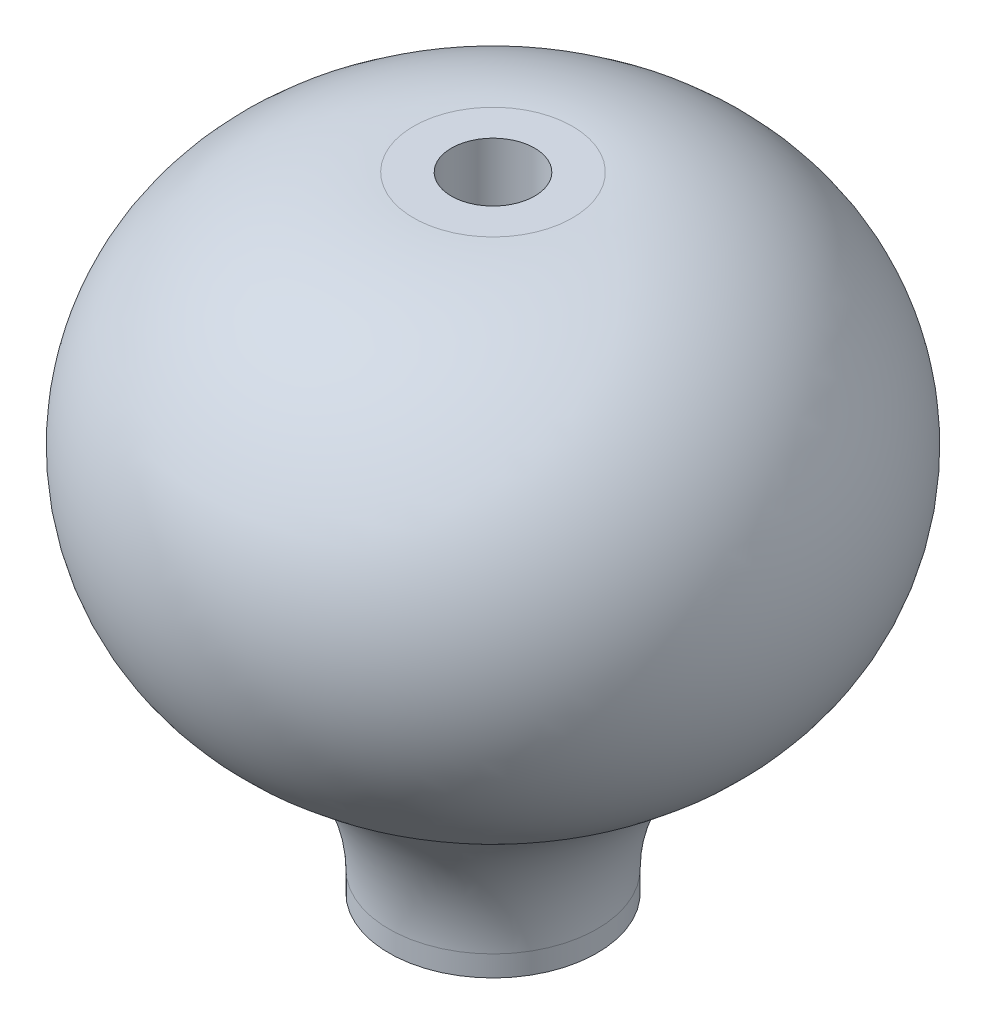
ISO-10303-21;
HEADER;
FILE_DESCRIPTION(('STEP AP214'),'2;1');
FILE_NAME('part.step','',(''),(''),'','','');
FILE_SCHEMA(('AUTOMOTIVE_DESIGN { 1 0 10303 214 1 1 1 1 }'));
ENDSEC;
DATA;
#1=APPLICATION_CONTEXT('core data for automotive mechanical design processes');
#2=APPLICATION_PROTOCOL_DEFINITION('international standard','automotive_design',2000,#1);
#3=PRODUCT_CONTEXT('',#1,'mechanical');
#4=PRODUCT('Part','Part','',(#3));
#5=PRODUCT_RELATED_PRODUCT_CATEGORY('part','',(#4));
#6=PRODUCT_DEFINITION_FORMATION('','',#4);
#7=PRODUCT_DEFINITION_CONTEXT('part definition',#1,'design');
#8=PRODUCT_DEFINITION('design','',#6,#7);
#9=PRODUCT_DEFINITION_SHAPE('','',#8);
#10=(LENGTH_UNIT() NAMED_UNIT(*) SI_UNIT(.MILLI.,.METRE.));
#11=(NAMED_UNIT(*) PLANE_ANGLE_UNIT() SI_UNIT($,.RADIAN.));
#12=(NAMED_UNIT(*) SI_UNIT($,.STERADIAN.) SOLID_ANGLE_UNIT());
#13=UNCERTAINTY_MEASURE_WITH_UNIT(LENGTH_MEASURE(1.E-05),#10,'distance_accuracy_value','');
#14=(GEOMETRIC_REPRESENTATION_CONTEXT(3) GLOBAL_UNCERTAINTY_ASSIGNED_CONTEXT((#13)) GLOBAL_UNIT_ASSIGNED_CONTEXT((#10,
#11,#12)) REPRESENTATION_CONTEXT('',''));
#15=CARTESIAN_POINT('',(0.,0.,0.));
#16=DIRECTION('',(0.,0.,1.));
#17=DIRECTION('',(1.,0.,0.));
#18=AXIS2_PLACEMENT_3D('',#15,#16,#17);
#19=CARTESIAN_POINT('',(0.,38.1,0.));
#20=DIRECTION('',(0.,1.,0.));
#21=DIRECTION('',(0.,0.,1.));
#22=AXIS2_PLACEMENT_3D('',#19,#20,#21);
#23=PLANE('',#22);
#24=CARTESIAN_POINT('',(0.,38.1,0.));
#25=DIRECTION('',(0.,1.,0.));
#26=DIRECTION('',(0.,0.,1.));
#27=AXIS2_PLACEMENT_3D('',#24,#25,#26);
#28=CIRCLE('',#27,2.54);
#29=CARTESIAN_POINT('',(0.,38.1,2.54));
#30=VERTEX_POINT('',#29);
#31=EDGE_CURVE('E68',#30,#30,#28,.T.);
#32=ORIENTED_EDGE('',*,*,#31,.F.);
#33=EDGE_LOOP('',(#32));
#34=FACE_BOUND('',#33,.T.);
#35=CARTESIAN_POINT('',(0.,38.1,0.));
#36=DIRECTION('',(0.,-1.,0.));
#37=DIRECTION('',(0.,0.,-1.));
#38=AXIS2_PLACEMENT_3D('',#35,#36,#37);
#39=CIRCLE('',#38,4.84877197327399);
#40=CARTESIAN_POINT('',(0.,38.1,-4.84877197327399));
#41=VERTEX_POINT('',#40);
#42=EDGE_CURVE('E12',#41,#41,#39,.T.);
#43=ORIENTED_EDGE('',*,*,#42,.F.);
#44=EDGE_LOOP('',(#43));
#45=FACE_BOUND('',#44,.T.);
#46=ADVANCED_FACE('F48',(#34,#45),#23,.T.);
#47=CARTESIAN_POINT('',(0.,23.667543946548,0.));
#48=DIRECTION('',(0.,-1.,0.));
#49=DIRECTION('',(0.,0.,-1.));
#50=AXIS2_PLACEMENT_3D('',#47,#48,#49);
#51=DEGENERATE_TOROIDAL_SURFACE('',#50,4.84877197327399,14.432456053452,.T.);
#52=ORIENTED_EDGE('',*,*,#42,.T.);
#53=EDGE_LOOP('',(#52));
#54=FACE_BOUND('',#53,.T.);
#55=CARTESIAN_POINT('',(0.,11.1686703652562,0.));
#56=DIRECTION('',(0.,-1.,0.));
#57=DIRECTION('',(0.,0.,-1.));
#58=AXIS2_PLACEMENT_3D('',#55,#56,#57);
#59=CIRCLE('',#58,12.065);
#60=CARTESIAN_POINT('',(0.,11.1686703652562,-12.065));
#61=VERTEX_POINT('',#60);
#62=EDGE_CURVE('E54',#61,#61,#59,.T.);
#63=ORIENTED_EDGE('',*,*,#62,.F.);
#64=EDGE_LOOP('',(#63));
#65=FACE_BOUND('',#64,.T.);
#66=ADVANCED_FACE('F85',(#54,#65),#51,.T.);
#67=CARTESIAN_POINT('',(0.,1.26999999999999,0.));
#68=DIRECTION('',(0.,-1.,0.));
#69=DIRECTION('',(0.,0.,-1.));
#70=AXIS2_PLACEMENT_3D('',#67,#68,#69);
#71=TOROIDAL_SURFACE('',#70,17.78,11.43);
#72=ORIENTED_EDGE('',*,*,#62,.T.);
#73=EDGE_LOOP('',(#72));
#74=FACE_BOUND('',#73,.T.);
#75=CARTESIAN_POINT('',(0.,1.26999999999999,0.));
#76=DIRECTION('',(0.,-1.,0.));
#77=DIRECTION('',(0.,0.,-1.));
#78=AXIS2_PLACEMENT_3D('',#75,#76,#77);
#79=CIRCLE('',#78,6.35);
#80=CARTESIAN_POINT('',(0.,1.26999999999999,-6.35));
#81=VERTEX_POINT('',#80);
#82=EDGE_CURVE('E58',#81,#81,#79,.T.);
#83=ORIENTED_EDGE('',*,*,#82,.F.);
#84=EDGE_LOOP('',(#83));
#85=FACE_BOUND('',#84,.T.);
#86=ADVANCED_FACE('F89',(#74,#85),#71,.F.);
#87=CARTESIAN_POINT('',(0.,0.,0.));
#88=DIRECTION('',(0.,-1.,0.));
#89=DIRECTION('',(0.,0.,-1.));
#90=AXIS2_PLACEMENT_3D('',#87,#88,#89);
#91=CYLINDRICAL_SURFACE('',#90,6.35);
#92=ORIENTED_EDGE('',*,*,#82,.T.);
#93=EDGE_LOOP('',(#92));
#94=FACE_BOUND('',#93,.T.);
#95=CARTESIAN_POINT('',(0.,0.,0.));
#96=DIRECTION('',(0.,-1.,0.));
#97=DIRECTION('',(0.,0.,-1.));
#98=AXIS2_PLACEMENT_3D('',#95,#96,#97);
#99=CIRCLE('',#98,6.35);
#100=CARTESIAN_POINT('',(0.,0.,-6.35));
#101=VERTEX_POINT('',#100);
#102=EDGE_CURVE('E62',#101,#101,#99,.T.);
#103=ORIENTED_EDGE('',*,*,#102,.F.);
#104=EDGE_LOOP('',(#103));
#105=FACE_BOUND('',#104,.T.);
#106=ADVANCED_FACE('F93',(#94,#105),#91,.T.);
#107=CARTESIAN_POINT('',(0.,0.,0.));
#108=DIRECTION('',(0.,-1.,0.));
#109=DIRECTION('',(0.,0.,-1.));
#110=AXIS2_PLACEMENT_3D('',#107,#108,#109);
#111=PLANE('',#110);
#112=CARTESIAN_POINT('',(0.,0.,0.));
#113=DIRECTION('',(0.,1.,0.));
#114=DIRECTION('',(0.,0.,1.));
#115=AXIS2_PLACEMENT_3D('',#112,#113,#114);
#116=CIRCLE('',#115,2.54);
#117=CARTESIAN_POINT('',(0.,0.,2.54));
#118=VERTEX_POINT('',#117);
#119=EDGE_CURVE('E67',#118,#118,#116,.T.);
#120=ORIENTED_EDGE('',*,*,#119,.T.);
#121=EDGE_LOOP('',(#120));
#122=FACE_BOUND('',#121,.T.);
#123=ORIENTED_EDGE('',*,*,#102,.T.);
#124=EDGE_LOOP('',(#123));
#125=FACE_BOUND('',#124,.T.);
#126=ADVANCED_FACE('F74',(#122,#125),#111,.T.);
#127=CARTESIAN_POINT('',(0.,0.,0.));
#128=DIRECTION('',(0.,1.,0.));
#129=DIRECTION('',(0.,0.,1.));
#130=AXIS2_PLACEMENT_3D('',#127,#128,#129);
#131=CYLINDRICAL_SURFACE('',#130,2.54);
#132=CARTESIAN_POINT('',(0.,0.,2.54));
#133=CARTESIAN_POINT('',(0.,0.396875000000001,2.54));
#134=CARTESIAN_POINT('',(0.,0.793750000000001,2.54));
#135=CARTESIAN_POINT('',(0.,1.5875,2.54));
#136=CARTESIAN_POINT('',(0.,1.984375,2.54));
#137=CARTESIAN_POINT('',(0.,2.778125,2.54));
#138=CARTESIAN_POINT('',(0.,3.175,2.54));
#139=CARTESIAN_POINT('',(0.,3.96875,2.54));
#140=CARTESIAN_POINT('',(0.,4.365625,2.54));
#141=CARTESIAN_POINT('',(0.,5.159375,2.54));
#142=CARTESIAN_POINT('',(0.,5.55625,2.54));
#143=CARTESIAN_POINT('',(0.,6.35,2.54));
#144=CARTESIAN_POINT('',(0.,6.746875,2.54));
#145=CARTESIAN_POINT('',(0.,7.540625,2.54));
#146=CARTESIAN_POINT('',(0.,7.9375,2.54));
#147=CARTESIAN_POINT('',(0.,8.73125,2.54));
#148=CARTESIAN_POINT('',(0.,9.128125,2.54));
#149=CARTESIAN_POINT('',(0.,9.921875,2.54));
#150=CARTESIAN_POINT('',(0.,10.31875,2.54));
#151=CARTESIAN_POINT('',(0.,11.1125,2.54));
#152=CARTESIAN_POINT('',(0.,11.509375,2.54));
#153=CARTESIAN_POINT('',(0.,12.303125,2.54));
#154=CARTESIAN_POINT('',(0.,12.7,2.54));
#155=CARTESIAN_POINT('',(0.,13.49375,2.54));
#156=CARTESIAN_POINT('',(0.,13.890625,2.54));
#157=CARTESIAN_POINT('',(0.,14.684375,2.54));
#158=CARTESIAN_POINT('',(0.,15.08125,2.54));
#159=CARTESIAN_POINT('',(0.,15.875,2.54));
#160=CARTESIAN_POINT('',(0.,16.271875,2.54));
#161=CARTESIAN_POINT('',(0.,17.065625,2.54));
#162=CARTESIAN_POINT('',(0.,17.4625,2.54));
#163=CARTESIAN_POINT('',(0.,18.25625,2.54));
#164=CARTESIAN_POINT('',(0.,18.653125,2.54));
#165=CARTESIAN_POINT('',(0.,19.446875,2.54));
#166=CARTESIAN_POINT('',(0.,19.84375,2.54));
#167=CARTESIAN_POINT('',(0.,20.6375,2.54));
#168=CARTESIAN_POINT('',(0.,21.034375,2.54));
#169=CARTESIAN_POINT('',(0.,21.828125,2.54));
#170=CARTESIAN_POINT('',(0.,22.225,2.54));
#171=CARTESIAN_POINT('',(0.,23.01875,2.54));
#172=CARTESIAN_POINT('',(0.,23.415625,2.54));
#173=CARTESIAN_POINT('',(0.,24.209375,2.54));
#174=CARTESIAN_POINT('',(0.,24.60625,2.54));
#175=CARTESIAN_POINT('',(0.,25.4,2.54));
#176=CARTESIAN_POINT('',(0.,25.796875,2.54));
#177=CARTESIAN_POINT('',(0.,26.590625,2.54));
#178=CARTESIAN_POINT('',(0.,26.9875,2.54));
#179=CARTESIAN_POINT('',(0.,27.78125,2.54));
#180=CARTESIAN_POINT('',(0.,28.178125,2.54));
#181=CARTESIAN_POINT('',(0.,28.971875,2.54));
#182=CARTESIAN_POINT('',(0.,29.36875,2.54));
#183=CARTESIAN_POINT('',(0.,30.1625,2.54));
#184=CARTESIAN_POINT('',(0.,30.559375,2.54));
#185=CARTESIAN_POINT('',(0.,31.353125,2.54));
#186=CARTESIAN_POINT('',(0.,31.75,2.54));
#187=CARTESIAN_POINT('',(0.,32.54375,2.54));
#188=CARTESIAN_POINT('',(0.,32.940625,2.54));
#189=CARTESIAN_POINT('',(0.,33.734375,2.54));
#190=CARTESIAN_POINT('',(0.,34.13125,2.54));
#191=CARTESIAN_POINT('',(0.,34.925,2.54));
#192=CARTESIAN_POINT('',(0.,35.321875,2.54));
#193=CARTESIAN_POINT('',(0.,36.115625,2.54));
#194=CARTESIAN_POINT('',(0.,36.5125,2.54));
#195=CARTESIAN_POINT('',(0.,37.30625,2.54));
#196=CARTESIAN_POINT('',(0.,37.703125,2.54));
#197=CARTESIAN_POINT('',(0.,38.1,2.54));
#198=B_SPLINE_CURVE_WITH_KNOTS('',3,(#132,#133,#134,#135,#136,#137,#138,#139,#140,#141,#142,
#143,#144,#145,#146,#147,#148,#149,#150,#151,#152,#153,#154,#155,#156,#157,#158,#159,#160,#161,
#162,#163,#164,#165,#166,#167,#168,#169,#170,#171,#172,#173,#174,#175,#176,#177,#178,#179,#180,
#181,#182,#183,#184,#185,#186,#187,#188,#189,#190,#191,#192,#193,#194,#195,#196,#197),
.UNSPECIFIED.,.F.,.F.,(4,2,2,2,2,2,2,2,2,2,2,2,2,2,2,2,2,2,2,2,2,2,2,2,2,2,2,2,2,2,2,2,4),(0.,
1.190625,2.38125,3.571875,4.7625,5.953125,7.14375,8.334375,9.525,10.715625,11.90625,13.096875,
14.2875,15.478125,16.66875,17.859375,19.05,20.240625,21.43125,22.621875,23.8125,25.003125,
26.19375,27.384375,28.575,29.765625,30.95625,32.146875,33.3375,34.528125,35.71875,36.909375,
38.1),.UNSPECIFIED.);
#199=EDGE_CURVE('BSEAM77',#118,#30,#198,.T.);
#200=ORIENTED_EDGE('',*,*,#119,.F.);
#201=ORIENTED_EDGE('',*,*,#31,.T.);
#202=ORIENTED_EDGE('',*,*,#199,.T.);
#203=ORIENTED_EDGE('',*,*,#199,.F.);
#204=EDGE_LOOP('',(#200,#202,#201,#203));
#205=FACE_BOUND('',#204,.T.);
#206=ADVANCED_FACE('F77',(#205),#131,.F.);
#207=CLOSED_SHELL('',(#46,#66,#86,#106,#126,#206));
#208=MANIFOLD_SOLID_BREP('B2',#207);
#209=ADVANCED_BREP_SHAPE_REPRESENTATION('',(#18,#208),#14);
#210=SHAPE_DEFINITION_REPRESENTATION(#9,#209);
ENDSEC;
END-ISO-10303-21;
